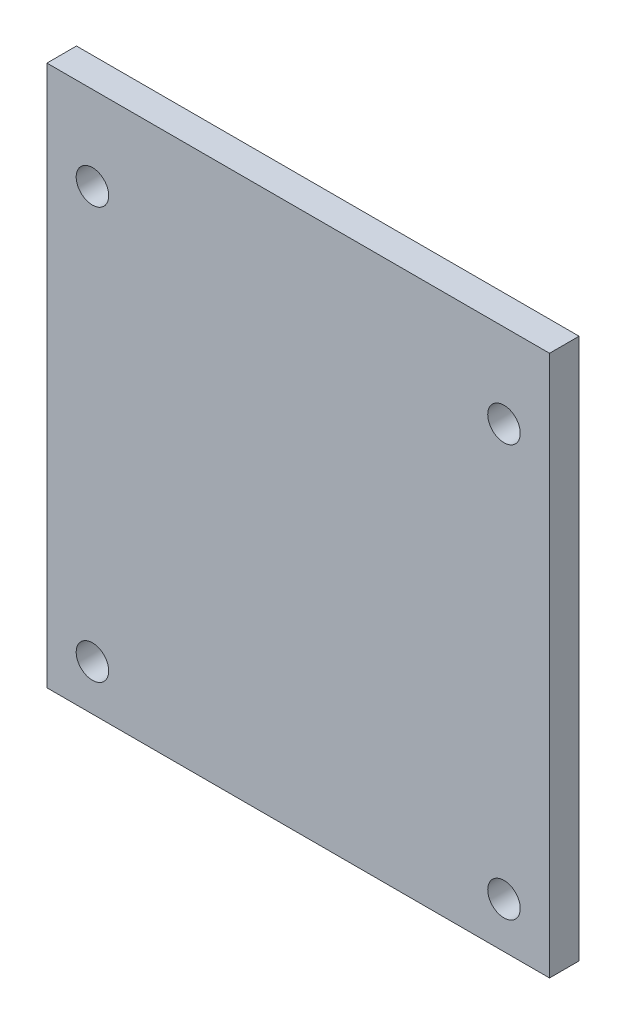
ISO-10303-21;
HEADER;
FILE_DESCRIPTION(('STEP AP214'),'2;1');
FILE_NAME('part.step','',(''),(''),'','','');
FILE_SCHEMA(('AUTOMOTIVE_DESIGN { 1 0 10303 214 1 1 1 1 }'));
ENDSEC;
DATA;
#1=APPLICATION_CONTEXT('core data for automotive mechanical design processes');
#2=APPLICATION_PROTOCOL_DEFINITION('international standard','automotive_design',2000,#1);
#3=PRODUCT_CONTEXT('',#1,'mechanical');
#4=PRODUCT('Part','Part','',(#3));
#5=PRODUCT_RELATED_PRODUCT_CATEGORY('part','',(#4));
#6=PRODUCT_DEFINITION_FORMATION('','',#4);
#7=PRODUCT_DEFINITION_CONTEXT('part definition',#1,'design');
#8=PRODUCT_DEFINITION('design','',#6,#7);
#9=PRODUCT_DEFINITION_SHAPE('','',#8);
#10=(LENGTH_UNIT() NAMED_UNIT(*) SI_UNIT(.MILLI.,.METRE.));
#11=(NAMED_UNIT(*) PLANE_ANGLE_UNIT() SI_UNIT($,.RADIAN.));
#12=(NAMED_UNIT(*) SI_UNIT($,.STERADIAN.) SOLID_ANGLE_UNIT());
#13=UNCERTAINTY_MEASURE_WITH_UNIT(LENGTH_MEASURE(1.E-05),#10,'distance_accuracy_value','');
#14=(GEOMETRIC_REPRESENTATION_CONTEXT(3) GLOBAL_UNCERTAINTY_ASSIGNED_CONTEXT((#13)) GLOBAL_UNIT_ASSIGNED_CONTEXT((#10,
#11,#12)) REPRESENTATION_CONTEXT('',''));
#15=CARTESIAN_POINT('',(0.,0.,0.));
#16=DIRECTION('',(0.,0.,1.));
#17=DIRECTION('',(1.,0.,0.));
#18=AXIS2_PLACEMENT_3D('',#15,#16,#17);
#19=CARTESIAN_POINT('',(0.,6.49999999999996,5.));
#20=DIRECTION('',(1.,0.,0.));
#21=DIRECTION('',(0.,1.,0.));
#22=AXIS2_PLACEMENT_3D('',#19,#20,#21);
#23=PLANE('',#22);
#24=DIRECTION('',(0.,-1.,0.));
#25=VECTOR('',#24,1.);
#26=CARTESIAN_POINT('',(0.,6.49999999999996,0.));
#27=LINE('',#26,#25);
#28=CARTESIAN_POINT('',(0.,6.49999999999996,0.));
#29=VERTEX_POINT('',#28);
#30=CARTESIAN_POINT('',(0.,-85.,0.));
#31=VERTEX_POINT('',#30);
#32=EDGE_CURVE('E94',#29,#31,#27,.T.);
#33=ORIENTED_EDGE('',*,*,#32,.T.);
#34=DIRECTION('',(0.,0.,-1.));
#35=VECTOR('',#34,1.);
#36=CARTESIAN_POINT('',(0.,-85.,5.));
#37=LINE('',#36,#35);
#38=CARTESIAN_POINT('',(0.,-85.,5.));
#39=VERTEX_POINT('',#38);
#40=EDGE_CURVE('E11',#39,#31,#37,.T.);
#41=ORIENTED_EDGE('',*,*,#40,.F.);
#42=DIRECTION('',(0.,-1.,0.));
#43=VECTOR('',#42,1.);
#44=CARTESIAN_POINT('',(0.,6.49999999999996,5.));
#45=LINE('',#44,#43);
#46=CARTESIAN_POINT('',(0.,6.49999999999996,5.));
#47=VERTEX_POINT('',#46);
#48=EDGE_CURVE('E82',#47,#39,#45,.T.);
#49=ORIENTED_EDGE('',*,*,#48,.F.);
#50=DIRECTION('',(0.,0.,-1.));
#51=VECTOR('',#50,1.);
#52=CARTESIAN_POINT('',(0.,6.49999999999996,5.));
#53=LINE('',#52,#51);
#54=EDGE_CURVE('E90',#47,#29,#53,.T.);
#55=ORIENTED_EDGE('',*,*,#54,.T.);
#56=EDGE_LOOP('',(#33,#41,#49,#55));
#57=FACE_BOUND('',#56,.T.);
#58=ADVANCED_FACE('F31',(#57),#23,.F.);
#59=CARTESIAN_POINT('',(0.,-85.,5.));
#60=DIRECTION('',(0.,1.,0.));
#61=DIRECTION('',(0.,0.,1.));
#62=AXIS2_PLACEMENT_3D('',#59,#60,#61);
#63=PLANE('',#62);
#64=DIRECTION('',(1.,0.,0.));
#65=VECTOR('',#64,1.);
#66=CARTESIAN_POINT('',(0.,-85.,0.));
#67=LINE('',#66,#65);
#68=CARTESIAN_POINT('',(85.,-85.,0.));
#69=VERTEX_POINT('',#68);
#70=EDGE_CURVE('E86',#31,#69,#67,.T.);
#71=ORIENTED_EDGE('',*,*,#70,.T.);
#72=DIRECTION('',(0.,0.,-1.));
#73=VECTOR('',#72,1.);
#74=CARTESIAN_POINT('',(85.,-85.,5.));
#75=LINE('',#74,#73);
#76=CARTESIAN_POINT('',(85.,-85.,5.));
#77=VERTEX_POINT('',#76);
#78=EDGE_CURVE('E39',#77,#69,#75,.T.);
#79=ORIENTED_EDGE('',*,*,#78,.F.);
#80=DIRECTION('',(1.,0.,0.));
#81=VECTOR('',#80,1.);
#82=CARTESIAN_POINT('',(0.,-85.,5.));
#83=LINE('',#82,#81);
#84=EDGE_CURVE('E77',#39,#77,#83,.T.);
#85=ORIENTED_EDGE('',*,*,#84,.F.);
#86=ORIENTED_EDGE('',*,*,#40,.T.);
#87=EDGE_LOOP('',(#71,#79,#85,#86));
#88=FACE_BOUND('',#87,.T.);
#89=ADVANCED_FACE('F85',(#88),#63,.F.);
#90=CARTESIAN_POINT('',(85.,6.49999999999996,5.));
#91=DIRECTION('',(-1.,0.,0.));
#92=DIRECTION('',(0.,-1.,0.));
#93=AXIS2_PLACEMENT_3D('',#90,#91,#92);
#94=PLANE('',#93);
#95=DIRECTION('',(0.,1.,0.));
#96=VECTOR('',#95,1.);
#97=CARTESIAN_POINT('',(85.,6.49999999999996,0.));
#98=LINE('',#97,#96);
#99=CARTESIAN_POINT('',(85.,6.49999999999996,0.));
#100=VERTEX_POINT('',#99);
#101=EDGE_CURVE('E64',#69,#100,#98,.T.);
#102=ORIENTED_EDGE('',*,*,#101,.T.);
#103=DIRECTION('',(0.,0.,-1.));
#104=VECTOR('',#103,1.);
#105=CARTESIAN_POINT('',(85.,6.49999999999996,5.));
#106=LINE('',#105,#104);
#107=CARTESIAN_POINT('',(85.,6.49999999999996,5.));
#108=VERTEX_POINT('',#107);
#109=EDGE_CURVE('E87',#108,#100,#106,.T.);
#110=ORIENTED_EDGE('',*,*,#109,.F.);
#111=DIRECTION('',(0.,1.,0.));
#112=VECTOR('',#111,1.);
#113=CARTESIAN_POINT('',(85.,6.49999999999996,5.));
#114=LINE('',#113,#112);
#115=EDGE_CURVE('E80',#77,#108,#114,.T.);
#116=ORIENTED_EDGE('',*,*,#115,.F.);
#117=ORIENTED_EDGE('',*,*,#78,.T.);
#118=EDGE_LOOP('',(#102,#110,#116,#117));
#119=FACE_BOUND('',#118,.T.);
#120=ADVANCED_FACE('F88',(#119),#94,.F.);
#121=CARTESIAN_POINT('',(0.,6.49999999999996,5.));
#122=DIRECTION('',(0.,-1.,0.));
#123=DIRECTION('',(0.,0.,-1.));
#124=AXIS2_PLACEMENT_3D('',#121,#122,#123);
#125=PLANE('',#124);
#126=DIRECTION('',(-1.,0.,0.));
#127=VECTOR('',#126,1.);
#128=CARTESIAN_POINT('',(0.,6.49999999999996,0.));
#129=LINE('',#128,#127);
#130=EDGE_CURVE('E70',#100,#29,#129,.T.);
#131=ORIENTED_EDGE('',*,*,#130,.T.);
#132=ORIENTED_EDGE('',*,*,#54,.F.);
#133=DIRECTION('',(-1.,0.,0.));
#134=VECTOR('',#133,1.);
#135=CARTESIAN_POINT('',(0.,6.49999999999996,5.));
#136=LINE('',#135,#134);
#137=EDGE_CURVE('E47',#108,#47,#136,.T.);
#138=ORIENTED_EDGE('',*,*,#137,.F.);
#139=ORIENTED_EDGE('',*,*,#109,.T.);
#140=EDGE_LOOP('',(#131,#132,#138,#139));
#141=FACE_BOUND('',#140,.T.);
#142=ADVANCED_FACE('F102',(#141),#125,.F.);
#143=CARTESIAN_POINT('',(0.,-85.,5.));
#144=DIRECTION('',(0.,0.,1.));
#145=DIRECTION('',(1.,0.,0.));
#146=AXIS2_PLACEMENT_3D('',#143,#144,#145);
#147=PLANE('',#146);
#148=CARTESIAN_POINT('',(7.69999999999999,-7.70000000000002,5.));
#149=DIRECTION('',(0.,0.,-1.));
#150=DIRECTION('',(-1.,0.,0.));
#151=AXIS2_PLACEMENT_3D('',#148,#149,#150);
#152=CIRCLE('',#151,2.75000000000001);
#153=CARTESIAN_POINT('',(4.94999999999998,-7.70000000000002,5.));
#154=VERTEX_POINT('',#153);
#155=EDGE_CURVE('E123',#154,#154,#152,.T.);
#156=ORIENTED_EDGE('',*,*,#155,.T.);
#157=EDGE_LOOP('',(#156));
#158=FACE_BOUND('',#157,.T.);
#159=CARTESIAN_POINT('',(77.3,-7.70000000000004,5.));
#160=DIRECTION('',(0.,0.,-1.));
#161=DIRECTION('',(-1.,0.,0.));
#162=AXIS2_PLACEMENT_3D('',#159,#160,#161);
#163=CIRCLE('',#162,2.75000000000001);
#164=CARTESIAN_POINT('',(74.55,-7.70000000000004,5.));
#165=VERTEX_POINT('',#164);
#166=EDGE_CURVE('E117',#165,#165,#163,.T.);
#167=ORIENTED_EDGE('',*,*,#166,.T.);
#168=EDGE_LOOP('',(#167));
#169=FACE_BOUND('',#168,.T.);
#170=CARTESIAN_POINT('',(77.3,-77.3,5.));
#171=DIRECTION('',(0.,0.,-1.));
#172=DIRECTION('',(-1.,0.,0.));
#173=AXIS2_PLACEMENT_3D('',#170,#171,#172);
#174=CIRCLE('',#173,2.75000000000001);
#175=CARTESIAN_POINT('',(74.55,-77.3,5.));
#176=VERTEX_POINT('',#175);
#177=EDGE_CURVE('E111',#176,#176,#174,.T.);
#178=ORIENTED_EDGE('',*,*,#177,.T.);
#179=EDGE_LOOP('',(#178));
#180=FACE_BOUND('',#179,.T.);
#181=CARTESIAN_POINT('',(7.69999999999999,-77.3,5.));
#182=DIRECTION('',(0.,0.,-1.));
#183=DIRECTION('',(-1.,0.,0.));
#184=AXIS2_PLACEMENT_3D('',#181,#182,#183);
#185=CIRCLE('',#184,2.75000000000001);
#186=CARTESIAN_POINT('',(4.94999999999998,-77.3,5.));
#187=VERTEX_POINT('',#186);
#188=EDGE_CURVE('E97',#187,#187,#185,.T.);
#189=ORIENTED_EDGE('',*,*,#188,.T.);
#190=EDGE_LOOP('',(#189));
#191=FACE_BOUND('',#190,.T.);
#192=ORIENTED_EDGE('',*,*,#48,.T.);
#193=ORIENTED_EDGE('',*,*,#84,.T.);
#194=ORIENTED_EDGE('',*,*,#115,.T.);
#195=ORIENTED_EDGE('',*,*,#137,.T.);
#196=EDGE_LOOP('',(#192,#193,#194,#195));
#197=FACE_BOUND('',#196,.T.);
#198=ADVANCED_FACE('F78',(#158,#169,#180,#191,#197),#147,.T.);
#199=CARTESIAN_POINT('',(0.,-85.,0.));
#200=DIRECTION('',(0.,0.,1.));
#201=DIRECTION('',(1.,0.,0.));
#202=AXIS2_PLACEMENT_3D('',#199,#200,#201);
#203=PLANE('',#202);
#204=CARTESIAN_POINT('',(7.69999999999999,-7.70000000000002,0.));
#205=DIRECTION('',(0.,0.,-1.));
#206=DIRECTION('',(-1.,0.,0.));
#207=AXIS2_PLACEMENT_3D('',#204,#205,#206);
#208=CIRCLE('',#207,2.75000000000001);
#209=CARTESIAN_POINT('',(4.94999999999998,-7.70000000000002,0.));
#210=VERTEX_POINT('',#209);
#211=EDGE_CURVE('E126',#210,#210,#208,.T.);
#212=ORIENTED_EDGE('',*,*,#211,.F.);
#213=EDGE_LOOP('',(#212));
#214=FACE_BOUND('',#213,.T.);
#215=CARTESIAN_POINT('',(77.3,-7.70000000000004,0.));
#216=DIRECTION('',(0.,0.,-1.));
#217=DIRECTION('',(-1.,0.,0.));
#218=AXIS2_PLACEMENT_3D('',#215,#216,#217);
#219=CIRCLE('',#218,2.75000000000001);
#220=CARTESIAN_POINT('',(74.55,-7.70000000000004,0.));
#221=VERTEX_POINT('',#220);
#222=EDGE_CURVE('E120',#221,#221,#219,.T.);
#223=ORIENTED_EDGE('',*,*,#222,.F.);
#224=EDGE_LOOP('',(#223));
#225=FACE_BOUND('',#224,.T.);
#226=CARTESIAN_POINT('',(77.3,-77.3,0.));
#227=DIRECTION('',(0.,0.,-1.));
#228=DIRECTION('',(-1.,0.,0.));
#229=AXIS2_PLACEMENT_3D('',#226,#227,#228);
#230=CIRCLE('',#229,2.75000000000001);
#231=CARTESIAN_POINT('',(74.55,-77.3,0.));
#232=VERTEX_POINT('',#231);
#233=EDGE_CURVE('E114',#232,#232,#230,.T.);
#234=ORIENTED_EDGE('',*,*,#233,.F.);
#235=EDGE_LOOP('',(#234));
#236=FACE_BOUND('',#235,.T.);
#237=CARTESIAN_POINT('',(7.69999999999999,-77.3,0.));
#238=DIRECTION('',(0.,0.,-1.));
#239=DIRECTION('',(-1.,0.,0.));
#240=AXIS2_PLACEMENT_3D('',#237,#238,#239);
#241=CIRCLE('',#240,2.75000000000001);
#242=CARTESIAN_POINT('',(4.94999999999998,-77.3,0.));
#243=VERTEX_POINT('',#242);
#244=EDGE_CURVE('E108',#243,#243,#241,.T.);
#245=ORIENTED_EDGE('',*,*,#244,.F.);
#246=EDGE_LOOP('',(#245));
#247=FACE_BOUND('',#246,.T.);
#248=ORIENTED_EDGE('',*,*,#32,.F.);
#249=ORIENTED_EDGE('',*,*,#130,.F.);
#250=ORIENTED_EDGE('',*,*,#101,.F.);
#251=ORIENTED_EDGE('',*,*,#70,.F.);
#252=EDGE_LOOP('',(#248,#249,#250,#251));
#253=FACE_BOUND('',#252,.T.);
#254=ADVANCED_FACE('F105',(#214,#225,#236,#247,#253),#203,.F.);
#255=CARTESIAN_POINT('',(7.69999999999999,-77.3,5.));
#256=DIRECTION('',(0.,0.,-1.));
#257=DIRECTION('',(-1.,0.,0.));
#258=AXIS2_PLACEMENT_3D('',#255,#256,#257);
#259=CYLINDRICAL_SURFACE('',#258,2.75000000000001);
#260=ORIENTED_EDGE('',*,*,#188,.F.);
#261=EDGE_LOOP('',(#260));
#262=FACE_BOUND('',#261,.T.);
#263=ORIENTED_EDGE('',*,*,#244,.T.);
#264=EDGE_LOOP('',(#263));
#265=FACE_BOUND('',#264,.T.);
#266=ADVANCED_FACE('F143',(#262,#265),#259,.F.);
#267=CARTESIAN_POINT('',(77.3,-77.3,5.));
#268=DIRECTION('',(0.,0.,-1.));
#269=DIRECTION('',(-1.,0.,0.));
#270=AXIS2_PLACEMENT_3D('',#267,#268,#269);
#271=CYLINDRICAL_SURFACE('',#270,2.75000000000001);
#272=ORIENTED_EDGE('',*,*,#177,.F.);
#273=EDGE_LOOP('',(#272));
#274=FACE_BOUND('',#273,.T.);
#275=ORIENTED_EDGE('',*,*,#233,.T.);
#276=EDGE_LOOP('',(#275));
#277=FACE_BOUND('',#276,.T.);
#278=ADVANCED_FACE('F152',(#274,#277),#271,.F.);
#279=CARTESIAN_POINT('',(77.3,-7.70000000000004,5.));
#280=DIRECTION('',(0.,0.,-1.));
#281=DIRECTION('',(-1.,0.,0.));
#282=AXIS2_PLACEMENT_3D('',#279,#280,#281);
#283=CYLINDRICAL_SURFACE('',#282,2.75000000000001);
#284=ORIENTED_EDGE('',*,*,#166,.F.);
#285=EDGE_LOOP('',(#284));
#286=FACE_BOUND('',#285,.T.);
#287=ORIENTED_EDGE('',*,*,#222,.T.);
#288=EDGE_LOOP('',(#287));
#289=FACE_BOUND('',#288,.T.);
#290=ADVANCED_FACE('F137',(#286,#289),#283,.F.);
#291=CARTESIAN_POINT('',(7.69999999999999,-7.70000000000002,5.));
#292=DIRECTION('',(0.,0.,-1.));
#293=DIRECTION('',(-1.,0.,0.));
#294=AXIS2_PLACEMENT_3D('',#291,#292,#293);
#295=CYLINDRICAL_SURFACE('',#294,2.75000000000001);
#296=ORIENTED_EDGE('',*,*,#155,.F.);
#297=EDGE_LOOP('',(#296));
#298=FACE_BOUND('',#297,.T.);
#299=ORIENTED_EDGE('',*,*,#211,.T.);
#300=EDGE_LOOP('',(#299));
#301=FACE_BOUND('',#300,.T.);
#302=ADVANCED_FACE('F134',(#298,#301),#295,.F.);
#303=CLOSED_SHELL('',(#58,#89,#120,#142,#198,#254,#266,#278,#290,#302));
#304=MANIFOLD_SOLID_BREP('B2',#303);
#305=ADVANCED_BREP_SHAPE_REPRESENTATION('',(#18,#304),#14);
#306=SHAPE_DEFINITION_REPRESENTATION(#9,#305);
ENDSEC;
END-ISO-10303-21;
